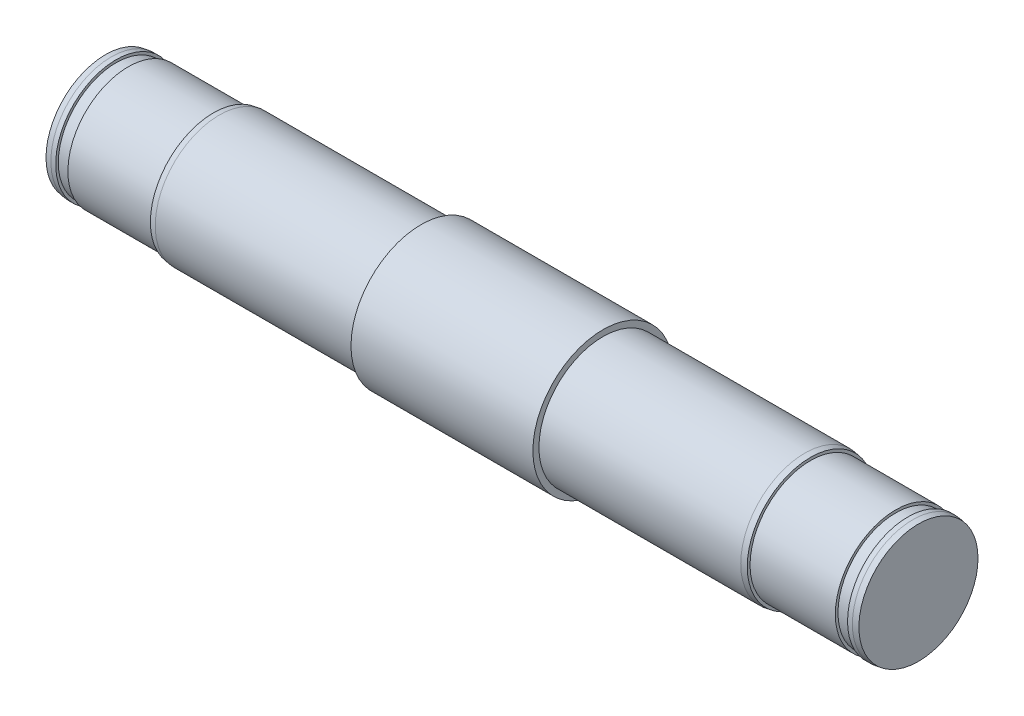
ISO-10303-21;
HEADER;
FILE_DESCRIPTION(('STEP AP214'),'2;1');
FILE_NAME('part.step','',(''),(''),'','','');
FILE_SCHEMA(('AUTOMOTIVE_DESIGN { 1 0 10303 214 1 1 1 1 }'));
ENDSEC;
DATA;
#1=APPLICATION_CONTEXT('core data for automotive mechanical design processes');
#2=APPLICATION_PROTOCOL_DEFINITION('international standard','automotive_design',2000,#1);
#3=PRODUCT_CONTEXT('',#1,'mechanical');
#4=PRODUCT('Part','Part','',(#3));
#5=PRODUCT_RELATED_PRODUCT_CATEGORY('part','',(#4));
#6=PRODUCT_DEFINITION_FORMATION('','',#4);
#7=PRODUCT_DEFINITION_CONTEXT('part definition',#1,'design');
#8=PRODUCT_DEFINITION('design','',#6,#7);
#9=PRODUCT_DEFINITION_SHAPE('','',#8);
#10=(LENGTH_UNIT() NAMED_UNIT(*) SI_UNIT(.MILLI.,.METRE.));
#11=(NAMED_UNIT(*) PLANE_ANGLE_UNIT() SI_UNIT($,.RADIAN.));
#12=(NAMED_UNIT(*) SI_UNIT($,.STERADIAN.) SOLID_ANGLE_UNIT());
#13=UNCERTAINTY_MEASURE_WITH_UNIT(LENGTH_MEASURE(1.E-05),#10,'distance_accuracy_value','');
#14=(GEOMETRIC_REPRESENTATION_CONTEXT(3) GLOBAL_UNCERTAINTY_ASSIGNED_CONTEXT((#13)) GLOBAL_UNIT_ASSIGNED_CONTEXT((#10,
#11,#12)) REPRESENTATION_CONTEXT('',''));
#15=CARTESIAN_POINT('',(0.,0.,0.));
#16=DIRECTION('',(0.,0.,1.));
#17=DIRECTION('',(1.,0.,0.));
#18=AXIS2_PLACEMENT_3D('',#15,#16,#17);
#19=CARTESIAN_POINT('',(0.,0.,0.));
#20=DIRECTION('',(1.,0.,0.));
#21=DIRECTION('',(0.,0.,-1.));
#22=AXIS2_PLACEMENT_3D('',#19,#20,#21);
#23=CYLINDRICAL_SURFACE('',#22,8.5);
#24=CARTESIAN_POINT('',(-42.,0.,0.));
#25=DIRECTION('',(-1.,0.,0.));
#26=DIRECTION('',(0.,0.,1.));
#27=AXIS2_PLACEMENT_3D('',#24,#25,#26);
#28=CIRCLE('',#27,8.5);
#29=CARTESIAN_POINT('',(-42.,0.,8.5));
#30=VERTEX_POINT('',#29);
#31=EDGE_CURVE('E63',#30,#30,#28,.T.);
#32=ORIENTED_EDGE('',*,*,#31,.T.);
#33=EDGE_LOOP('',(#32));
#34=FACE_BOUND('',#33,.T.);
#35=CARTESIAN_POINT('',(-54.,0.,0.));
#36=DIRECTION('',(-1.,0.,0.));
#37=DIRECTION('',(0.,-1.,0.));
#38=AXIS2_PLACEMENT_3D('',#35,#36,#37);
#39=CIRCLE('',#38,8.5);
#40=CARTESIAN_POINT('',(-54.,-8.5,0.));
#41=VERTEX_POINT('',#40);
#42=EDGE_CURVE('E120',#41,#41,#39,.T.);
#43=ORIENTED_EDGE('',*,*,#42,.F.);
#44=EDGE_LOOP('',(#43));
#45=FACE_BOUND('',#44,.T.);
#46=ADVANCED_FACE('F39',(#34,#45),#23,.T.);
#47=CARTESIAN_POINT('',(0.,0.,0.));
#48=DIRECTION('',(-1.,0.,0.));
#49=DIRECTION('',(0.,0.,1.));
#50=AXIS2_PLACEMENT_3D('',#47,#48,#49);
#51=CYLINDRICAL_SURFACE('',#50,8.5);
#52=CARTESIAN_POINT('',(42.,0.,0.));
#53=DIRECTION('',(-1.,0.,0.));
#54=DIRECTION('',(0.,0.,1.));
#55=AXIS2_PLACEMENT_3D('',#52,#53,#54);
#56=CIRCLE('',#55,8.5);
#57=CARTESIAN_POINT('',(42.,0.,8.5));
#58=VERTEX_POINT('',#57);
#59=EDGE_CURVE('E67',#58,#58,#56,.T.);
#60=ORIENTED_EDGE('',*,*,#59,.F.);
#61=EDGE_LOOP('',(#60));
#62=FACE_BOUND('',#61,.T.);
#63=CARTESIAN_POINT('',(54.,0.,0.));
#64=DIRECTION('',(1.,0.,0.));
#65=DIRECTION('',(0.,1.,0.));
#66=AXIS2_PLACEMENT_3D('',#63,#64,#65);
#67=CIRCLE('',#66,8.5);
#68=CARTESIAN_POINT('',(54.,8.5,0.));
#69=VERTEX_POINT('',#68);
#70=EDGE_CURVE('E88',#69,#69,#67,.T.);
#71=ORIENTED_EDGE('',*,*,#70,.F.);
#72=EDGE_LOOP('',(#71));
#73=FACE_BOUND('',#72,.T.);
#74=ADVANCED_FACE('F143',(#62,#73),#51,.T.);
#75=CARTESIAN_POINT('',(0.,0.,0.));
#76=DIRECTION('',(-1.,0.,0.));
#77=DIRECTION('',(0.,0.,1.));
#78=AXIS2_PLACEMENT_3D('',#75,#76,#77);
#79=CYLINDRICAL_SURFACE('',#78,9.86);
#80=CARTESIAN_POINT('',(12.8,0.,0.));
#81=DIRECTION('',(-1.,0.,0.));
#82=DIRECTION('',(0.,0.,1.));
#83=AXIS2_PLACEMENT_3D('',#80,#81,#82);
#84=CIRCLE('',#83,9.86);
#85=CARTESIAN_POINT('',(12.8,0.,9.86));
#86=VERTEX_POINT('',#85);
#87=EDGE_CURVE('E68',#86,#86,#84,.T.);
#88=CARTESIAN_POINT('',(-12.8,0.,0.));
#89=DIRECTION('',(-1.,0.,0.));
#90=DIRECTION('',(0.,0.,1.));
#91=AXIS2_PLACEMENT_3D('',#88,#89,#90);
#92=CIRCLE('',#91,9.86);
#93=CARTESIAN_POINT('',(-12.8,0.,9.86));
#94=VERTEX_POINT('',#93);
#95=EDGE_CURVE('E62',#94,#94,#92,.T.);
#96=CARTESIAN_POINT('',(12.8,0.,9.86));
#97=CARTESIAN_POINT('',(12.5333333333333,0.,9.86));
#98=CARTESIAN_POINT('',(12.2666666666667,0.,9.86));
#99=CARTESIAN_POINT('',(11.7333333333333,0.,9.86));
#100=CARTESIAN_POINT('',(11.4666666666667,0.,9.86));
#101=CARTESIAN_POINT('',(10.9333333333333,0.,9.86));
#102=CARTESIAN_POINT('',(10.6666666666667,0.,9.86));
#103=CARTESIAN_POINT('',(10.1333333333333,0.,9.86));
#104=CARTESIAN_POINT('',(9.86666666666667,0.,9.86));
#105=CARTESIAN_POINT('',(9.33333333333333,0.,9.86));
#106=CARTESIAN_POINT('',(9.06666666666667,0.,9.86));
#107=CARTESIAN_POINT('',(8.53333333333333,0.,9.86));
#108=CARTESIAN_POINT('',(8.26666666666667,0.,9.86));
#109=CARTESIAN_POINT('',(7.73333333333333,0.,9.86));
#110=CARTESIAN_POINT('',(7.46666666666667,0.,9.86));
#111=CARTESIAN_POINT('',(6.93333333333333,0.,9.86));
#112=CARTESIAN_POINT('',(6.66666666666667,0.,9.86));
#113=CARTESIAN_POINT('',(6.13333333333333,0.,9.86));
#114=CARTESIAN_POINT('',(5.86666666666667,0.,9.86));
#115=CARTESIAN_POINT('',(5.33333333333333,0.,9.86));
#116=CARTESIAN_POINT('',(5.06666666666667,0.,9.86));
#117=CARTESIAN_POINT('',(4.53333333333333,0.,9.86));
#118=CARTESIAN_POINT('',(4.26666666666667,0.,9.86));
#119=CARTESIAN_POINT('',(3.73333333333333,0.,9.86));
#120=CARTESIAN_POINT('',(3.46666666666667,0.,9.86));
#121=CARTESIAN_POINT('',(2.93333333333333,0.,9.86));
#122=CARTESIAN_POINT('',(2.66666666666667,0.,9.86));
#123=CARTESIAN_POINT('',(2.13333333333333,0.,9.86));
#124=CARTESIAN_POINT('',(1.86666666666667,0.,9.86));
#125=CARTESIAN_POINT('',(1.33333333333333,0.,9.86));
#126=CARTESIAN_POINT('',(1.06666666666667,0.,9.86));
#127=CARTESIAN_POINT('',(0.533333333333334,0.,9.86));
#128=CARTESIAN_POINT('',(0.266666666666667,0.,9.86));
#129=CARTESIAN_POINT('',(-0.266666666666667,0.,9.86));
#130=CARTESIAN_POINT('',(-0.533333333333334,0.,9.86));
#131=CARTESIAN_POINT('',(-1.06666666666667,0.,9.86));
#132=CARTESIAN_POINT('',(-1.33333333333333,0.,9.86));
#133=CARTESIAN_POINT('',(-1.86666666666667,0.,9.86));
#134=CARTESIAN_POINT('',(-2.13333333333333,0.,9.86));
#135=CARTESIAN_POINT('',(-2.66666666666667,0.,9.86));
#136=CARTESIAN_POINT('',(-2.93333333333333,0.,9.86));
#137=CARTESIAN_POINT('',(-3.46666666666667,0.,9.86));
#138=CARTESIAN_POINT('',(-3.73333333333333,0.,9.86));
#139=CARTESIAN_POINT('',(-4.26666666666667,0.,9.86));
#140=CARTESIAN_POINT('',(-4.53333333333333,0.,9.86));
#141=CARTESIAN_POINT('',(-5.06666666666667,0.,9.86));
#142=CARTESIAN_POINT('',(-5.33333333333333,0.,9.86));
#143=CARTESIAN_POINT('',(-5.86666666666667,0.,9.86));
#144=CARTESIAN_POINT('',(-6.13333333333333,0.,9.86));
#145=CARTESIAN_POINT('',(-6.66666666666667,0.,9.86));
#146=CARTESIAN_POINT('',(-6.93333333333333,0.,9.86));
#147=CARTESIAN_POINT('',(-7.46666666666667,0.,9.86));
#148=CARTESIAN_POINT('',(-7.73333333333333,0.,9.86));
#149=CARTESIAN_POINT('',(-8.26666666666667,0.,9.86));
#150=CARTESIAN_POINT('',(-8.53333333333333,0.,9.86));
#151=CARTESIAN_POINT('',(-9.06666666666667,0.,9.86));
#152=CARTESIAN_POINT('',(-9.33333333333333,0.,9.86));
#153=CARTESIAN_POINT('',(-9.86666666666667,0.,9.86));
#154=CARTESIAN_POINT('',(-10.1333333333333,0.,9.86));
#155=CARTESIAN_POINT('',(-10.6666666666667,0.,9.86));
#156=CARTESIAN_POINT('',(-10.9333333333333,0.,9.86));
#157=CARTESIAN_POINT('',(-11.4666666666667,0.,9.86));
#158=CARTESIAN_POINT('',(-11.7333333333333,0.,9.86));
#159=CARTESIAN_POINT('',(-12.2666666666667,0.,9.86));
#160=CARTESIAN_POINT('',(-12.5333333333333,0.,9.86));
#161=CARTESIAN_POINT('',(-12.8,0.,9.86));
#162=B_SPLINE_CURVE_WITH_KNOTS('',3,(#96,#97,#98,#99,#100,#101,#102,#103,#104,#105,#106,#107,
#108,#109,#110,#111,#112,#113,#114,#115,#116,#117,#118,#119,#120,#121,#122,#123,#124,#125,#126,
#127,#128,#129,#130,#131,#132,#133,#134,#135,#136,#137,#138,#139,#140,#141,#142,#143,#144,#145,
#146,#147,#148,#149,#150,#151,#152,#153,#154,#155,#156,#157,#158,#159,#160,#161),.UNSPECIFIED.,
.F.,.F.,(4,2,2,2,2,2,2,2,2,2,2,2,2,2,2,2,2,2,2,2,2,2,2,2,2,2,2,2,2,2,2,2,4),(0.,0.8,1.6,2.4,3.2,
4.,4.8,5.6,6.4,7.2,8.,8.8,9.6,10.4,11.2,12.,12.8,13.6,14.4,15.2,16.,16.8,17.6,18.4,19.2,20.,
20.8,21.6,22.4,23.2,24.,24.8,25.6),.UNSPECIFIED.);
#163=EDGE_CURVE('BSEAM148',#86,#94,#162,.T.);
#164=ORIENTED_EDGE('',*,*,#87,.T.);
#165=ORIENTED_EDGE('',*,*,#95,.F.);
#166=ORIENTED_EDGE('',*,*,#163,.T.);
#167=ORIENTED_EDGE('',*,*,#163,.F.);
#168=EDGE_LOOP('',(#164,#166,#165,#167));
#169=FACE_BOUND('',#168,.T.);
#170=ADVANCED_FACE('F148',(#169),#79,.T.);
#171=CARTESIAN_POINT('',(12.8,9.86,0.));
#172=DIRECTION('',(-1.,0.,0.));
#173=DIRECTION('',(0.,0.,1.));
#174=AXIS2_PLACEMENT_3D('',#171,#172,#173);
#175=PLANE('',#174);
#176=ORIENTED_EDGE('',*,*,#87,.F.);
#177=EDGE_LOOP('',(#176));
#178=FACE_BOUND('',#177,.T.);
#179=CARTESIAN_POINT('',(12.8,0.,0.));
#180=DIRECTION('',(-1.,0.,0.));
#181=DIRECTION('',(0.,0.,1.));
#182=AXIS2_PLACEMENT_3D('',#179,#180,#181);
#183=CIRCLE('',#182,9.01);
#184=CARTESIAN_POINT('',(12.8,0.,9.01));
#185=VERTEX_POINT('',#184);
#186=EDGE_CURVE('E73',#185,#185,#183,.T.);
#187=ORIENTED_EDGE('',*,*,#186,.T.);
#188=EDGE_LOOP('',(#187));
#189=FACE_BOUND('',#188,.T.);
#190=ADVANCED_FACE('F157',(#178,#189),#175,.F.);
#191=CARTESIAN_POINT('',(0.,0.,0.));
#192=DIRECTION('',(-1.,0.,0.));
#193=DIRECTION('',(0.,0.,1.));
#194=AXIS2_PLACEMENT_3D('',#191,#192,#193);
#195=CYLINDRICAL_SURFACE('',#194,9.01);
#196=CARTESIAN_POINT('',(41.2,0.,0.));
#197=DIRECTION('',(-1.,0.,0.));
#198=DIRECTION('',(0.,0.,1.));
#199=AXIS2_PLACEMENT_3D('',#196,#197,#198);
#200=CIRCLE('',#199,9.01);
#201=CARTESIAN_POINT('',(41.2,0.,9.01));
#202=VERTEX_POINT('',#201);
#203=EDGE_CURVE('E77',#202,#202,#200,.T.);
#204=ORIENTED_EDGE('',*,*,#203,.T.);
#205=EDGE_LOOP('',(#204));
#206=FACE_BOUND('',#205,.T.);
#207=ORIENTED_EDGE('',*,*,#186,.F.);
#208=EDGE_LOOP('',(#207));
#209=FACE_BOUND('',#208,.T.);
#210=ADVANCED_FACE('F161',(#206,#209),#195,.T.);
#211=CARTESIAN_POINT('',(42.,9.01,0.));
#212=DIRECTION('',(-1.,0.,0.));
#213=DIRECTION('',(0.,0.,1.));
#214=AXIS2_PLACEMENT_3D('',#211,#212,#213);
#215=PLANE('',#214);
#216=CARTESIAN_POINT('',(42.,0.,0.));
#217=DIRECTION('',(1.,0.,0.));
#218=DIRECTION('',(0.,0.,-1.));
#219=AXIS2_PLACEMENT_3D('',#216,#217,#218);
#220=CIRCLE('',#219,8.89009765311825);
#221=CARTESIAN_POINT('',(42.,0.,-8.89009765311825));
#222=VERTEX_POINT('',#221);
#223=EDGE_CURVE('E54',#222,#222,#220,.T.);
#224=ORIENTED_EDGE('',*,*,#223,.T.);
#225=EDGE_LOOP('',(#224));
#226=FACE_BOUND('',#225,.T.);
#227=ORIENTED_EDGE('',*,*,#59,.T.);
#228=EDGE_LOOP('',(#227));
#229=FACE_BOUND('',#228,.T.);
#230=ADVANCED_FACE('F165',(#226,#229),#215,.F.);
#231=CARTESIAN_POINT('',(-12.8,9.86,0.));
#232=DIRECTION('',(1.,0.,0.));
#233=DIRECTION('',(0.,0.,1.));
#234=AXIS2_PLACEMENT_3D('',#231,#232,#233);
#235=PLANE('',#234);
#236=ORIENTED_EDGE('',*,*,#95,.T.);
#237=EDGE_LOOP('',(#236));
#238=FACE_BOUND('',#237,.T.);
#239=CARTESIAN_POINT('',(-12.8,0.,0.));
#240=DIRECTION('',(-1.,0.,0.));
#241=DIRECTION('',(0.,0.,1.));
#242=AXIS2_PLACEMENT_3D('',#239,#240,#241);
#243=CIRCLE('',#242,9.01);
#244=CARTESIAN_POINT('',(-12.8,0.,9.01));
#245=VERTEX_POINT('',#244);
#246=EDGE_CURVE('E58',#245,#245,#243,.T.);
#247=ORIENTED_EDGE('',*,*,#246,.F.);
#248=EDGE_LOOP('',(#247));
#249=FACE_BOUND('',#248,.T.);
#250=ADVANCED_FACE('F169',(#238,#249),#235,.F.);
#251=CARTESIAN_POINT('',(0.,0.,0.));
#252=DIRECTION('',(1.,0.,0.));
#253=DIRECTION('',(0.,0.,-1.));
#254=AXIS2_PLACEMENT_3D('',#251,#252,#253);
#255=CYLINDRICAL_SURFACE('',#254,9.01);
#256=CARTESIAN_POINT('',(-41.2,0.,0.));
#257=DIRECTION('',(1.,0.,0.));
#258=DIRECTION('',(0.,0.,-1.));
#259=AXIS2_PLACEMENT_3D('',#256,#257,#258);
#260=CIRCLE('',#259,9.01);
#261=CARTESIAN_POINT('',(-41.2,0.,-9.01));
#262=VERTEX_POINT('',#261);
#263=EDGE_CURVE('E10',#262,#262,#260,.T.);
#264=ORIENTED_EDGE('',*,*,#263,.T.);
#265=EDGE_LOOP('',(#264));
#266=FACE_BOUND('',#265,.T.);
#267=ORIENTED_EDGE('',*,*,#246,.T.);
#268=EDGE_LOOP('',(#267));
#269=FACE_BOUND('',#268,.T.);
#270=ADVANCED_FACE('F173',(#266,#269),#255,.T.);
#271=CARTESIAN_POINT('',(-42.,9.01,0.));
#272=DIRECTION('',(1.,0.,0.));
#273=DIRECTION('',(0.,0.,1.));
#274=AXIS2_PLACEMENT_3D('',#271,#272,#273);
#275=PLANE('',#274);
#276=CARTESIAN_POINT('',(-42.,0.,0.));
#277=DIRECTION('',(-1.,0.,0.));
#278=DIRECTION('',(0.,0.,1.));
#279=AXIS2_PLACEMENT_3D('',#276,#277,#278);
#280=CIRCLE('',#279,8.89009765311825);
#281=CARTESIAN_POINT('',(-42.,0.,8.89009765311825));
#282=VERTEX_POINT('',#281);
#283=EDGE_CURVE('E48',#282,#282,#280,.T.);
#284=ORIENTED_EDGE('',*,*,#283,.T.);
#285=EDGE_LOOP('',(#284));
#286=FACE_BOUND('',#285,.T.);
#287=ORIENTED_EDGE('',*,*,#31,.F.);
#288=EDGE_LOOP('',(#287));
#289=FACE_BOUND('',#288,.T.);
#290=ADVANCED_FACE('F177',(#286,#289),#275,.F.);
#291=CARTESIAN_POINT('',(41.2,0.,0.));
#292=DIRECTION('',(-1.,0.,0.));
#293=DIRECTION('',(0.,0.,1.));
#294=AXIS2_PLACEMENT_3D('',#291,#292,#293);
#295=CONICAL_SURFACE('',#294,9.01,0.148770565132122);
#296=ORIENTED_EDGE('',*,*,#223,.F.);
#297=EDGE_LOOP('',(#296));
#298=FACE_BOUND('',#297,.T.);
#299=ORIENTED_EDGE('',*,*,#203,.F.);
#300=EDGE_LOOP('',(#299));
#301=FACE_BOUND('',#300,.T.);
#302=ADVANCED_FACE('F180',(#298,#301),#295,.T.);
#303=CARTESIAN_POINT('',(-41.2,0.,0.));
#304=DIRECTION('',(1.,0.,0.));
#305=DIRECTION('',(0.,0.,-1.));
#306=AXIS2_PLACEMENT_3D('',#303,#304,#305);
#307=CONICAL_SURFACE('',#306,9.01,0.148770565132122);
#308=ORIENTED_EDGE('',*,*,#263,.F.);
#309=EDGE_LOOP('',(#308));
#310=FACE_BOUND('',#309,.T.);
#311=ORIENTED_EDGE('',*,*,#283,.F.);
#312=EDGE_LOOP('',(#311));
#313=FACE_BOUND('',#312,.T.);
#314=ADVANCED_FACE('F184',(#310,#313),#307,.T.);
#315=CARTESIAN_POINT('',(55.72,8.126,0.));
#316=DIRECTION('',(-1.,0.,0.));
#317=DIRECTION('',(0.,0.,1.));
#318=AXIS2_PLACEMENT_3D('',#315,#316,#317);
#319=PLANE('',#318);
#320=CARTESIAN_POINT('',(55.72,0.,0.));
#321=DIRECTION('',(-1.,0.,0.));
#322=DIRECTION('',(0.,0.,1.));
#323=AXIS2_PLACEMENT_3D('',#320,#321,#322);
#324=CIRCLE('',#323,8.126);
#325=CARTESIAN_POINT('',(55.72,0.,8.126));
#326=VERTEX_POINT('',#325);
#327=EDGE_CURVE('E93',#326,#326,#324,.T.);
#328=ORIENTED_EDGE('',*,*,#327,.F.);
#329=EDGE_LOOP('',(#328));
#330=FACE_BOUND('',#329,.T.);
#331=CARTESIAN_POINT('',(55.72,0.,0.));
#332=DIRECTION('',(-1.,0.,0.));
#333=DIRECTION('',(0.,0.,1.));
#334=AXIS2_PLACEMENT_3D('',#331,#332,#333);
#335=CIRCLE('',#334,8.5);
#336=CARTESIAN_POINT('',(55.72,0.,8.5));
#337=VERTEX_POINT('',#336);
#338=EDGE_CURVE('E92',#337,#337,#335,.T.);
#339=ORIENTED_EDGE('',*,*,#338,.T.);
#340=EDGE_LOOP('',(#339));
#341=FACE_BOUND('',#340,.T.);
#342=ADVANCED_FACE('F188',(#330,#341),#319,.T.);
#343=CARTESIAN_POINT('',(54.,8.126,0.));
#344=DIRECTION('',(1.,0.,0.));
#345=DIRECTION('',(0.,0.,-1.));
#346=AXIS2_PLACEMENT_3D('',#343,#344,#345);
#347=PLANE('',#346);
#348=CARTESIAN_POINT('',(54.,0.,0.));
#349=DIRECTION('',(-1.,0.,0.));
#350=DIRECTION('',(0.,-1.,0.));
#351=AXIS2_PLACEMENT_3D('',#348,#349,#350);
#352=CIRCLE('',#351,8.126);
#353=CARTESIAN_POINT('',(54.,-8.126,0.));
#354=VERTEX_POINT('',#353);
#355=EDGE_CURVE('E94',#354,#354,#352,.T.);
#356=ORIENTED_EDGE('',*,*,#355,.T.);
#357=EDGE_LOOP('',(#356));
#358=FACE_BOUND('',#357,.T.);
#359=ORIENTED_EDGE('',*,*,#70,.T.);
#360=EDGE_LOOP('',(#359));
#361=FACE_BOUND('',#360,.T.);
#362=ADVANCED_FACE('F192',(#358,#361),#347,.T.);
#363=CARTESIAN_POINT('',(0.,0.,0.));
#364=DIRECTION('',(-1.,0.,0.));
#365=DIRECTION('',(0.,0.,1.));
#366=AXIS2_PLACEMENT_3D('',#363,#364,#365);
#367=CYLINDRICAL_SURFACE('',#366,8.126);
#368=ORIENTED_EDGE('',*,*,#327,.T.);
#369=EDGE_LOOP('',(#368));
#370=FACE_BOUND('',#369,.T.);
#371=ORIENTED_EDGE('',*,*,#355,.F.);
#372=EDGE_LOOP('',(#371));
#373=FACE_BOUND('',#372,.T.);
#374=ADVANCED_FACE('F196',(#370,#373),#367,.T.);
#375=CARTESIAN_POINT('',(57.2,8.5,0.));
#376=DIRECTION('',(-1.,0.,0.));
#377=DIRECTION('',(0.,0.,1.));
#378=AXIS2_PLACEMENT_3D('',#375,#376,#377);
#379=PLANE('',#378);
#380=CARTESIAN_POINT('',(57.2,0.,0.));
#381=DIRECTION('',(1.,0.,0.));
#382=DIRECTION('',(0.,0.,-1.));
#383=AXIS2_PLACEMENT_3D('',#380,#381,#382);
#384=CIRCLE('',#383,8.38009765311826);
#385=CARTESIAN_POINT('',(57.2,0.,-8.38009765311826));
#386=VERTEX_POINT('',#385);
#387=EDGE_CURVE('E108',#386,#386,#384,.T.);
#388=ORIENTED_EDGE('',*,*,#387,.T.);
#389=EDGE_LOOP('',(#388));
#390=FACE_BOUND('',#389,.T.);
#391=ADVANCED_FACE('F200',(#390),#379,.F.);
#392=CARTESIAN_POINT('',(56.4000000000001,0.,0.));
#393=DIRECTION('',(-1.,0.,0.));
#394=DIRECTION('',(0.,0.,1.));
#395=AXIS2_PLACEMENT_3D('',#392,#393,#394);
#396=CONICAL_SURFACE('',#395,8.5,0.148770565132122);
#397=ORIENTED_EDGE('',*,*,#387,.F.);
#398=EDGE_LOOP('',(#397));
#399=FACE_BOUND('',#398,.T.);
#400=CARTESIAN_POINT('',(56.4000000000001,0.,0.));
#401=DIRECTION('',(-1.,0.,0.));
#402=DIRECTION('',(0.,-1.,0.));
#403=AXIS2_PLACEMENT_3D('',#400,#401,#402);
#404=CIRCLE('',#403,8.5);
#405=CARTESIAN_POINT('',(56.4000000000001,-8.5,0.));
#406=VERTEX_POINT('',#405);
#407=EDGE_CURVE('E72',#406,#406,#404,.T.);
#408=ORIENTED_EDGE('',*,*,#407,.F.);
#409=EDGE_LOOP('',(#408));
#410=FACE_BOUND('',#409,.T.);
#411=ADVANCED_FACE('F204',(#399,#410),#396,.T.);
#412=ORIENTED_EDGE('',*,*,#407,.T.);
#413=EDGE_LOOP('',(#412));
#414=FACE_BOUND('',#413,.T.);
#415=ORIENTED_EDGE('',*,*,#338,.F.);
#416=EDGE_LOOP('',(#415));
#417=FACE_BOUND('',#416,.T.);
#418=ADVANCED_FACE('F151',(#414,#417),#51,.T.);
#419=CARTESIAN_POINT('',(-55.72,8.126,0.));
#420=DIRECTION('',(1.,0.,0.));
#421=DIRECTION('',(0.,0.,1.));
#422=AXIS2_PLACEMENT_3D('',#419,#420,#421);
#423=PLANE('',#422);
#424=CARTESIAN_POINT('',(-55.72,0.,0.));
#425=DIRECTION('',(-1.,0.,0.));
#426=DIRECTION('',(0.,0.,1.));
#427=AXIS2_PLACEMENT_3D('',#424,#425,#426);
#428=CIRCLE('',#427,8.126);
#429=CARTESIAN_POINT('',(-55.72,0.,8.126));
#430=VERTEX_POINT('',#429);
#431=EDGE_CURVE('E116',#430,#430,#428,.T.);
#432=ORIENTED_EDGE('',*,*,#431,.T.);
#433=EDGE_LOOP('',(#432));
#434=FACE_BOUND('',#433,.T.);
#435=CARTESIAN_POINT('',(-55.72,0.,0.));
#436=DIRECTION('',(1.,0.,0.));
#437=DIRECTION('',(0.,0.,-1.));
#438=AXIS2_PLACEMENT_3D('',#435,#436,#437);
#439=CIRCLE('',#438,8.5);
#440=CARTESIAN_POINT('',(-55.72,0.,-8.5));
#441=VERTEX_POINT('',#440);
#442=EDGE_CURVE('E98',#441,#441,#439,.T.);
#443=ORIENTED_EDGE('',*,*,#442,.T.);
#444=EDGE_LOOP('',(#443));
#445=FACE_BOUND('',#444,.T.);
#446=ADVANCED_FACE('F209',(#434,#445),#423,.T.);
#447=CARTESIAN_POINT('',(-54.,8.126,0.));
#448=DIRECTION('',(-1.,0.,0.));
#449=DIRECTION('',(0.,0.,-1.));
#450=AXIS2_PLACEMENT_3D('',#447,#448,#449);
#451=PLANE('',#450);
#452=CARTESIAN_POINT('',(-54.,0.,0.));
#453=DIRECTION('',(-1.,0.,0.));
#454=DIRECTION('',(0.,-1.,0.));
#455=AXIS2_PLACEMENT_3D('',#452,#453,#454);
#456=CIRCLE('',#455,8.126);
#457=CARTESIAN_POINT('',(-54.,-8.126,0.));
#458=VERTEX_POINT('',#457);
#459=EDGE_CURVE('E112',#458,#458,#456,.T.);
#460=ORIENTED_EDGE('',*,*,#459,.F.);
#461=EDGE_LOOP('',(#460));
#462=FACE_BOUND('',#461,.T.);
#463=ORIENTED_EDGE('',*,*,#42,.T.);
#464=EDGE_LOOP('',(#463));
#465=FACE_BOUND('',#464,.T.);
#466=ADVANCED_FACE('F212',(#462,#465),#451,.T.);
#467=CARTESIAN_POINT('',(0.,0.,0.));
#468=DIRECTION('',(1.,0.,0.));
#469=DIRECTION('',(0.,0.,-1.));
#470=AXIS2_PLACEMENT_3D('',#467,#468,#469);
#471=CYLINDRICAL_SURFACE('',#470,8.126);
#472=ORIENTED_EDGE('',*,*,#431,.F.);
#473=EDGE_LOOP('',(#472));
#474=FACE_BOUND('',#473,.T.);
#475=ORIENTED_EDGE('',*,*,#459,.T.);
#476=EDGE_LOOP('',(#475));
#477=FACE_BOUND('',#476,.T.);
#478=ADVANCED_FACE('F141',(#474,#477),#471,.T.);
#479=CARTESIAN_POINT('',(-57.2,8.5,0.));
#480=DIRECTION('',(1.,0.,0.));
#481=DIRECTION('',(0.,0.,1.));
#482=AXIS2_PLACEMENT_3D('',#479,#480,#481);
#483=PLANE('',#482);
#484=CARTESIAN_POINT('',(-57.2,0.,0.));
#485=DIRECTION('',(-1.,0.,0.));
#486=DIRECTION('',(0.,0.,1.));
#487=AXIS2_PLACEMENT_3D('',#484,#485,#486);
#488=CIRCLE('',#487,8.38009765311826);
#489=CARTESIAN_POINT('',(-57.2,0.,8.38009765311826));
#490=VERTEX_POINT('',#489);
#491=EDGE_CURVE('E43',#490,#490,#488,.T.);
#492=ORIENTED_EDGE('',*,*,#491,.T.);
#493=EDGE_LOOP('',(#492));
#494=FACE_BOUND('',#493,.T.);
#495=ADVANCED_FACE('F131',(#494),#483,.F.);
#496=CARTESIAN_POINT('',(-56.4000000000001,0.,0.));
#497=DIRECTION('',(1.,0.,0.));
#498=DIRECTION('',(0.,0.,-1.));
#499=AXIS2_PLACEMENT_3D('',#496,#497,#498);
#500=CONICAL_SURFACE('',#499,8.5,0.148770565132122);
#501=CARTESIAN_POINT('',(-56.4000000000001,0.,0.));
#502=DIRECTION('',(1.,0.,0.));
#503=DIRECTION('',(0.,1.,0.));
#504=AXIS2_PLACEMENT_3D('',#501,#502,#503);
#505=CIRCLE('',#504,8.5);
#506=CARTESIAN_POINT('',(-56.4000000000001,8.5,0.));
#507=VERTEX_POINT('',#506);
#508=EDGE_CURVE('E81',#507,#507,#505,.T.);
#509=ORIENTED_EDGE('',*,*,#508,.F.);
#510=EDGE_LOOP('',(#509));
#511=FACE_BOUND('',#510,.T.);
#512=ORIENTED_EDGE('',*,*,#491,.F.);
#513=EDGE_LOOP('',(#512));
#514=FACE_BOUND('',#513,.T.);
#515=ADVANCED_FACE('F41',(#511,#514),#500,.T.);
#516=ORIENTED_EDGE('',*,*,#508,.T.);
#517=EDGE_LOOP('',(#516));
#518=FACE_BOUND('',#517,.T.);
#519=ORIENTED_EDGE('',*,*,#442,.F.);
#520=EDGE_LOOP('',(#519));
#521=FACE_BOUND('',#520,.T.);
#522=ADVANCED_FACE('F134',(#518,#521),#23,.T.);
#523=CLOSED_SHELL('',(#46,#74,#170,#190,#210,#230,#250,#270,#290,#302,#314,#342,#362,#374,#391,
#411,#418,#446,#466,#478,#495,#515,#522));
#524=MANIFOLD_SOLID_BREP('B2',#523);
#525=ADVANCED_BREP_SHAPE_REPRESENTATION('',(#18,#524),#14);
#526=SHAPE_DEFINITION_REPRESENTATION(#9,#525);
ENDSEC;
END-ISO-10303-21;
